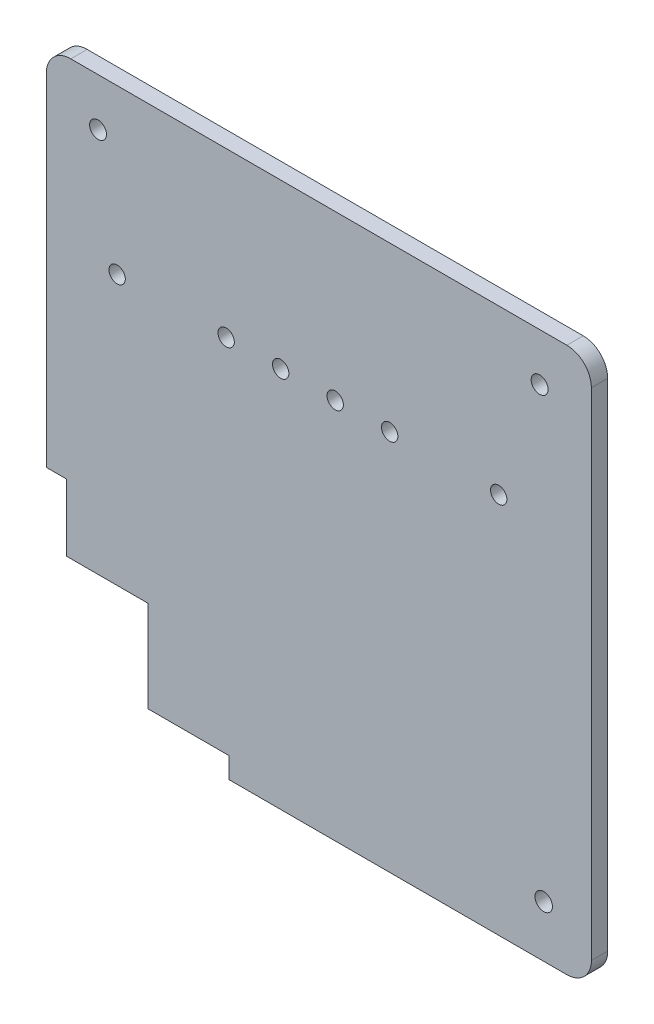
ISO-10303-21;
HEADER;
FILE_DESCRIPTION(('STEP AP214'),'2;1');
FILE_NAME('part.step','',(''),(''),'','','');
FILE_SCHEMA(('AUTOMOTIVE_DESIGN { 1 0 10303 214 1 1 1 1 }'));
ENDSEC;
DATA;
#1=APPLICATION_CONTEXT('core data for automotive mechanical design processes');
#2=APPLICATION_PROTOCOL_DEFINITION('international standard','automotive_design',2000,#1);
#3=PRODUCT_CONTEXT('',#1,'mechanical');
#4=PRODUCT('Part','Part','',(#3));
#5=PRODUCT_RELATED_PRODUCT_CATEGORY('part','',(#4));
#6=PRODUCT_DEFINITION_FORMATION('','',#4);
#7=PRODUCT_DEFINITION_CONTEXT('part definition',#1,'design');
#8=PRODUCT_DEFINITION('design','',#6,#7);
#9=PRODUCT_DEFINITION_SHAPE('','',#8);
#10=(LENGTH_UNIT() NAMED_UNIT(*) SI_UNIT(.MILLI.,.METRE.));
#11=(NAMED_UNIT(*) PLANE_ANGLE_UNIT() SI_UNIT($,.RADIAN.));
#12=(NAMED_UNIT(*) SI_UNIT($,.STERADIAN.) SOLID_ANGLE_UNIT());
#13=UNCERTAINTY_MEASURE_WITH_UNIT(LENGTH_MEASURE(1.E-05),#10,'distance_accuracy_value','');
#14=(GEOMETRIC_REPRESENTATION_CONTEXT(3) GLOBAL_UNCERTAINTY_ASSIGNED_CONTEXT((#13)) GLOBAL_UNIT_ASSIGNED_CONTEXT((#10,
#11,#12)) REPRESENTATION_CONTEXT('',''));
#15=CARTESIAN_POINT('',(0.,0.,0.));
#16=DIRECTION('',(0.,0.,1.));
#17=DIRECTION('',(1.,0.,0.));
#18=AXIS2_PLACEMENT_3D('',#15,#16,#17);
#19=CARTESIAN_POINT('',(0.,0.,0.));
#20=DIRECTION('',(0.,0.,-1.));
#21=DIRECTION('',(-1.,0.,0.));
#22=AXIS2_PLACEMENT_3D('',#19,#20,#21);
#23=PLANE('',#22);
#24=CARTESIAN_POINT('',(99.7846255346123,71.7613539983955,0.));
#25=DIRECTION('',(0.,0.,-1.));
#26=DIRECTION('',(-1.,0.,0.));
#27=AXIS2_PLACEMENT_3D('',#24,#25,#26);
#28=CIRCLE('',#27,1.50000000000001);
#29=CARTESIAN_POINT('',(98.2846255346123,71.7613539983955,0.));
#30=VERTEX_POINT('',#29);
#31=EDGE_CURVE('E320',#30,#30,#28,.T.);
#32=ORIENTED_EDGE('',*,*,#31,.F.);
#33=EDGE_LOOP('',(#32));
#34=FACE_BOUND('',#33,.T.);
#35=CARTESIAN_POINT('',(79.7846255346123,71.7613539983955,0.));
#36=DIRECTION('',(0.,0.,-1.));
#37=DIRECTION('',(-1.,0.,0.));
#38=AXIS2_PLACEMENT_3D('',#35,#36,#37);
#39=CIRCLE('',#38,1.5);
#40=CARTESIAN_POINT('',(78.2846255346123,71.7613539983955,0.));
#41=VERTEX_POINT('',#40);
#42=EDGE_CURVE('E324',#41,#41,#39,.T.);
#43=ORIENTED_EDGE('',*,*,#42,.F.);
#44=EDGE_LOOP('',(#43));
#45=FACE_BOUND('',#44,.T.);
#46=CARTESIAN_POINT('',(69.7846255346123,71.7613539983955,0.));
#47=DIRECTION('',(0.,0.,-1.));
#48=DIRECTION('',(-1.,0.,0.));
#49=AXIS2_PLACEMENT_3D('',#46,#47,#48);
#50=CIRCLE('',#49,1.5);
#51=CARTESIAN_POINT('',(68.2846255346123,71.7613539983955,0.));
#52=VERTEX_POINT('',#51);
#53=EDGE_CURVE('E328',#52,#52,#50,.T.);
#54=ORIENTED_EDGE('',*,*,#53,.F.);
#55=EDGE_LOOP('',(#54));
#56=FACE_BOUND('',#55,.T.);
#57=CARTESIAN_POINT('',(59.7846255346123,71.7613539983955,0.));
#58=DIRECTION('',(0.,0.,-1.));
#59=DIRECTION('',(-1.,0.,0.));
#60=AXIS2_PLACEMENT_3D('',#57,#58,#59);
#61=CIRCLE('',#60,1.5);
#62=CARTESIAN_POINT('',(58.2846255346123,71.7613539983955,0.));
#63=VERTEX_POINT('',#62);
#64=EDGE_CURVE('E332',#63,#63,#61,.T.);
#65=ORIENTED_EDGE('',*,*,#64,.F.);
#66=EDGE_LOOP('',(#65));
#67=FACE_BOUND('',#66,.T.);
#68=CARTESIAN_POINT('',(49.7846255346123,71.7613539983955,0.));
#69=DIRECTION('',(0.,0.,-1.));
#70=DIRECTION('',(-1.,0.,0.));
#71=AXIS2_PLACEMENT_3D('',#68,#69,#70);
#72=CIRCLE('',#71,1.5);
#73=CARTESIAN_POINT('',(48.2846255346123,71.7613539983955,0.));
#74=VERTEX_POINT('',#73);
#75=EDGE_CURVE('E336',#74,#74,#72,.T.);
#76=ORIENTED_EDGE('',*,*,#75,.F.);
#77=EDGE_LOOP('',(#76));
#78=FACE_BOUND('',#77,.T.);
#79=CARTESIAN_POINT('',(29.7846255346123,71.7613539983955,0.));
#80=DIRECTION('',(0.,0.,-1.));
#81=DIRECTION('',(-1.,0.,0.));
#82=AXIS2_PLACEMENT_3D('',#79,#80,#81);
#83=CIRCLE('',#82,1.5);
#84=CARTESIAN_POINT('',(28.2846255346123,71.7613539983955,0.));
#85=VERTEX_POINT('',#84);
#86=EDGE_CURVE('E340',#85,#85,#83,.T.);
#87=ORIENTED_EDGE('',*,*,#86,.F.);
#88=EDGE_LOOP('',(#87));
#89=FACE_BOUND('',#88,.T.);
#90=CARTESIAN_POINT('',(108.034625534612,11.2613539983955,0.));
#91=DIRECTION('',(0.,0.,-1.));
#92=DIRECTION('',(-1.,0.,0.));
#93=AXIS2_PLACEMENT_3D('',#90,#91,#92);
#94=CIRCLE('',#93,1.60000000000002);
#95=CARTESIAN_POINT('',(106.434625534612,11.2613539983955,0.));
#96=VERTEX_POINT('',#95);
#97=EDGE_CURVE('E344',#96,#96,#94,.T.);
#98=ORIENTED_EDGE('',*,*,#97,.F.);
#99=EDGE_LOOP('',(#98));
#100=FACE_BOUND('',#99,.T.);
#101=CARTESIAN_POINT('',(107.284625534612,93.0113539983955,0.));
#102=DIRECTION('',(0.,0.,-1.));
#103=DIRECTION('',(-1.,0.,0.));
#104=AXIS2_PLACEMENT_3D('',#101,#102,#103);
#105=CIRCLE('',#104,1.54999999999999);
#106=CARTESIAN_POINT('',(105.734625534612,93.0113539983955,0.));
#107=VERTEX_POINT('',#106);
#108=EDGE_CURVE('E348',#107,#107,#105,.T.);
#109=ORIENTED_EDGE('',*,*,#108,.F.);
#110=EDGE_LOOP('',(#109));
#111=FACE_BOUND('',#110,.T.);
#112=CARTESIAN_POINT('',(26.2846255346123,93.0113539983955,0.));
#113=DIRECTION('',(0.,0.,-1.));
#114=DIRECTION('',(-1.,0.,0.));
#115=AXIS2_PLACEMENT_3D('',#112,#113,#114);
#116=CIRCLE('',#115,1.54999999999999);
#117=CARTESIAN_POINT('',(24.7346255346123,93.0113539983955,0.));
#118=VERTEX_POINT('',#117);
#119=EDGE_CURVE('E268',#118,#118,#116,.T.);
#120=ORIENTED_EDGE('',*,*,#119,.F.);
#121=EDGE_LOOP('',(#120));
#122=FACE_BOUND('',#121,.T.);
#123=DIRECTION('',(0.,1.,0.));
#124=VECTOR('',#123,1.);
#125=CARTESIAN_POINT('',(20.4908440418059,0.,0.));
#126=LINE('',#125,#124);
#127=CARTESIAN_POINT('',(20.4908440418059,22.3527007298538,0.));
#128=VERTEX_POINT('',#127);
#129=CARTESIAN_POINT('',(20.4908440418059,34.6134342155972,0.));
#130=VERTEX_POINT('',#129);
#131=EDGE_CURVE('E195',#128,#130,#126,.T.);
#132=ORIENTED_EDGE('',*,*,#131,.T.);
#133=DIRECTION('',(-1.,0.,0.));
#134=VECTOR('',#133,1.);
#135=CARTESIAN_POINT('',(0.,34.6134342155972,0.));
#136=LINE('',#135,#134);
#137=CARTESIAN_POINT('',(16.7846255346119,34.6134342155972,0.));
#138=VERTEX_POINT('',#137);
#139=EDGE_CURVE('E11',#130,#138,#136,.T.);
#140=ORIENTED_EDGE('',*,*,#139,.T.);
#141=DIRECTION('',(0.,1.,0.));
#142=VECTOR('',#141,1.);
#143=CARTESIAN_POINT('',(16.7846255346117,-1.05037335566736E-13,0.));
#144=LINE('',#143,#142);
#145=CARTESIAN_POINT('',(16.7846255346123,97.2613539983955,0.));
#146=VERTEX_POINT('',#145);
#147=EDGE_CURVE('E39',#138,#146,#144,.T.);
#148=ORIENTED_EDGE('',*,*,#147,.T.);
#149=CARTESIAN_POINT('',(21.2846255346123,101.761353998396,0.));
#150=CARTESIAN_POINT('',(18.79523963462,101.818752836915,0.));
#151=CARTESIAN_POINT('',(16.8145351645291,99.6683323546178,0.));
#152=CARTESIAN_POINT('',(16.7846255346123,97.2613539983955,0.));
#153=B_SPLINE_CURVE_WITH_KNOTS('',3,(#149,#150,#151,#152),.UNSPECIFIED.,.F.,.F.,(4,4),(0.,1.),.UNSPECIFIED.);
#154=CARTESIAN_POINT('',(21.2846255346123,101.761353998396,0.));
#155=VERTEX_POINT('',#154);
#156=EDGE_CURVE('E251',#146,#155,#153,.F.);
#157=ORIENTED_EDGE('',*,*,#156,.T.);
#158=DIRECTION('',(1.,0.,0.));
#159=VECTOR('',#158,1.);
#160=CARTESIAN_POINT('',(0.,101.761353998396,0.));
#161=LINE('',#160,#159);
#162=CARTESIAN_POINT('',(112.284625534612,101.761353998396,0.));
#163=VERTEX_POINT('',#162);
#164=EDGE_CURVE('E245',#155,#163,#161,.T.);
#165=ORIENTED_EDGE('',*,*,#164,.T.);
#166=CARTESIAN_POINT('',(116.784625534612,97.2613539983955,0.));
#167=CARTESIAN_POINT('',(116.737279379155,99.8430426283221,0.));
#168=CARTESIAN_POINT('',(114.750732895399,101.731954246416,0.));
#169=CARTESIAN_POINT('',(112.284625534612,101.761353998396,0.));
#170=B_SPLINE_CURVE_WITH_KNOTS('',3,(#166,#167,#168,#169),.UNSPECIFIED.,.F.,.F.,(4,4),(0.,1.),.UNSPECIFIED.);
#171=CARTESIAN_POINT('',(116.784625534612,97.2613539983955,0.));
#172=VERTEX_POINT('',#171);
#173=EDGE_CURVE('E240',#163,#172,#170,.F.);
#174=ORIENTED_EDGE('',*,*,#173,.T.);
#175=DIRECTION('',(0.,-1.,0.));
#176=VECTOR('',#175,1.);
#177=CARTESIAN_POINT('',(116.784625534612,0.,0.));
#178=LINE('',#177,#176);
#179=CARTESIAN_POINT('',(116.784625534612,6.26135399839553,0.));
#180=VERTEX_POINT('',#179);
#181=EDGE_CURVE('E234',#172,#180,#178,.T.);
#182=ORIENTED_EDGE('',*,*,#181,.T.);
#183=CARTESIAN_POINT('',(112.284625534612,1.76135399839554,0.));
#184=CARTESIAN_POINT('',(114.734063302565,1.7748496881843,0.));
#185=CARTESIAN_POINT('',(116.776314504094,3.74614166838155,0.));
#186=CARTESIAN_POINT('',(116.784625534612,6.26135399839554,0.));
#187=B_SPLINE_CURVE_WITH_KNOTS('',3,(#183,#184,#185,#186),.UNSPECIFIED.,.F.,.F.,(4,4),(0.,1.),.UNSPECIFIED.);
#188=CARTESIAN_POINT('',(112.284625534612,1.76135399839554,0.));
#189=VERTEX_POINT('',#188);
#190=EDGE_CURVE('E229',#180,#189,#187,.F.);
#191=ORIENTED_EDGE('',*,*,#190,.T.);
#192=DIRECTION('',(-1.,0.,0.));
#193=VECTOR('',#192,1.);
#194=CARTESIAN_POINT('',(0.,1.76135399839553,0.));
#195=LINE('',#194,#193);
#196=CARTESIAN_POINT('',(50.3045910073756,1.76135399839553,0.));
#197=VERTEX_POINT('',#196);
#198=EDGE_CURVE('E226',#189,#197,#195,.T.);
#199=ORIENTED_EDGE('',*,*,#198,.T.);
#200=DIRECTION('',(0.,1.,0.));
#201=VECTOR('',#200,1.);
#202=CARTESIAN_POINT('',(50.3045910073756,0.,0.));
#203=LINE('',#202,#201);
#204=CARTESIAN_POINT('',(50.3045910073756,5.58312747882928,0.));
#205=VERTEX_POINT('',#204);
#206=EDGE_CURVE('E223',#197,#205,#203,.T.);
#207=ORIENTED_EDGE('',*,*,#206,.T.);
#208=DIRECTION('',(-1.,0.,0.));
#209=VECTOR('',#208,1.);
#210=CARTESIAN_POINT('',(0.,5.58312747882928,0.));
#211=LINE('',#210,#209);
#212=CARTESIAN_POINT('',(35.4429490806915,5.58312747882928,0.));
#213=VERTEX_POINT('',#212);
#214=EDGE_CURVE('E220',#205,#213,#211,.T.);
#215=ORIENTED_EDGE('',*,*,#214,.T.);
#216=DIRECTION('',(0.,1.,0.));
#217=VECTOR('',#216,1.);
#218=CARTESIAN_POINT('',(35.4429490806915,0.,0.));
#219=LINE('',#218,#217);
#220=CARTESIAN_POINT('',(35.4429490806914,22.3527007298538,0.));
#221=VERTEX_POINT('',#220);
#222=EDGE_CURVE('E218',#213,#221,#219,.T.);
#223=ORIENTED_EDGE('',*,*,#222,.T.);
#224=DIRECTION('',(-1.,0.,0.));
#225=VECTOR('',#224,1.);
#226=CARTESIAN_POINT('',(0.,22.3527007298538,0.));
#227=LINE('',#226,#225);
#228=EDGE_CURVE('E129',#221,#128,#227,.T.);
#229=ORIENTED_EDGE('',*,*,#228,.T.);
#230=EDGE_LOOP('',(#132,#140,#148,#157,#165,#174,#182,#191,#199,#207,#215,#223,#229));
#231=FACE_BOUND('',#230,.T.);
#232=ADVANCED_FACE('F32',(#34,#45,#56,#67,#78,#89,#100,#111,#122,#231),#23,.T.);
#233=CARTESIAN_POINT('',(16.7846255346119,34.6134342155972,-7.));
#234=DIRECTION('',(0.,-1.,0.));
#235=DIRECTION('',(0.,0.,-1.));
#236=AXIS2_PLACEMENT_3D('',#233,#234,#235);
#237=PLANE('',#236);
#238=DIRECTION('',(0.,0.,1.));
#239=VECTOR('',#238,1.);
#240=CARTESIAN_POINT('',(20.4908440418059,34.6134342155972,-7.));
#241=LINE('',#240,#239);
#242=CARTESIAN_POINT('',(20.4908440418059,34.6134342155972,3.));
#243=VERTEX_POINT('',#242);
#244=EDGE_CURVE('E54',#130,#243,#241,.T.);
#245=ORIENTED_EDGE('',*,*,#244,.T.);
#246=DIRECTION('',(1.,0.,0.));
#247=VECTOR('',#246,1.);
#248=CARTESIAN_POINT('',(16.7846255346119,34.6134342155972,3.));
#249=LINE('',#248,#247);
#250=CARTESIAN_POINT('',(16.7846255346119,34.6134342155972,3.));
#251=VERTEX_POINT('',#250);
#252=EDGE_CURVE('E149',#251,#243,#249,.T.);
#253=ORIENTED_EDGE('',*,*,#252,.F.);
#254=DIRECTION('',(0.,0.,1.));
#255=VECTOR('',#254,1.);
#256=CARTESIAN_POINT('',(16.7846255346119,34.6134342155972,-7.));
#257=LINE('',#256,#255);
#258=EDGE_CURVE('E193',#138,#251,#257,.T.);
#259=ORIENTED_EDGE('',*,*,#258,.F.);
#260=ORIENTED_EDGE('',*,*,#139,.F.);
#261=EDGE_LOOP('',(#245,#253,#259,#260));
#262=FACE_BOUND('',#261,.T.);
#263=ADVANCED_FACE('F267',(#262),#237,.T.);
#264=CARTESIAN_POINT('',(16.7846255346119,34.6134342155972,-7.));
#265=DIRECTION('',(-1.,0.,0.));
#266=DIRECTION('',(0.,-1.,0.));
#267=AXIS2_PLACEMENT_3D('',#264,#265,#266);
#268=PLANE('',#267);
#269=ORIENTED_EDGE('',*,*,#258,.T.);
#270=DIRECTION('',(0.,-1.,0.));
#271=VECTOR('',#270,1.);
#272=CARTESIAN_POINT('',(16.7846255346119,34.6134342155972,3.));
#273=LINE('',#272,#271);
#274=CARTESIAN_POINT('',(16.7846255346123,97.2613539983955,3.));
#275=VERTEX_POINT('',#274);
#276=EDGE_CURVE('E187',#275,#251,#273,.T.);
#277=ORIENTED_EDGE('',*,*,#276,.F.);
#278=DIRECTION('',(0.,0.,1.));
#279=VECTOR('',#278,1.);
#280=CARTESIAN_POINT('',(16.7846255346123,97.2613539983955,-7.));
#281=LINE('',#280,#279);
#282=EDGE_CURVE('E196',#146,#275,#281,.T.);
#283=ORIENTED_EDGE('',*,*,#282,.F.);
#284=ORIENTED_EDGE('',*,*,#147,.F.);
#285=EDGE_LOOP('',(#269,#277,#283,#284));
#286=FACE_BOUND('',#285,.T.);
#287=ADVANCED_FACE('F263',(#286),#268,.T.);
#288=CARTESIAN_POINT('',(21.2846255346123,101.761353998396,-7.));
#289=CARTESIAN_POINT('',(18.79523963462,101.818752836915,-7.));
#290=CARTESIAN_POINT('',(16.8145351645291,99.6683323546178,-7.));
#291=CARTESIAN_POINT('',(16.7846255346123,97.2613539983955,-7.));
#292=B_SPLINE_CURVE_WITH_KNOTS('',3,(#288,#289,#290,#291),.UNSPECIFIED.,.F.,.F.,(4,4),(0.,1.),.UNSPECIFIED.);
#293=DIRECTION('',(0.,0.,1.));
#294=VECTOR('',#293,1.);
#295=SURFACE_OF_LINEAR_EXTRUSION('',#292,#294);
#296=ORIENTED_EDGE('',*,*,#282,.T.);
#297=CARTESIAN_POINT('',(21.2846255346123,101.761353998396,3.));
#298=CARTESIAN_POINT('',(18.79523963462,101.818752836915,3.));
#299=CARTESIAN_POINT('',(16.8145351645291,99.6683323546178,3.));
#300=CARTESIAN_POINT('',(16.7846255346123,97.2613539983955,3.));
#301=B_SPLINE_CURVE_WITH_KNOTS('',3,(#297,#298,#299,#300),.UNSPECIFIED.,.F.,.F.,(4,4),(0.,1.),.UNSPECIFIED.);
#302=CARTESIAN_POINT('',(21.2846255346123,101.761353998396,3.));
#303=VERTEX_POINT('',#302);
#304=EDGE_CURVE('E182',#303,#275,#301,.T.);
#305=ORIENTED_EDGE('',*,*,#304,.F.);
#306=DIRECTION('',(0.,0.,1.));
#307=VECTOR('',#306,1.);
#308=CARTESIAN_POINT('',(21.2846255346123,101.761353998396,-7.));
#309=LINE('',#308,#307);
#310=EDGE_CURVE('E198',#155,#303,#309,.T.);
#311=ORIENTED_EDGE('',*,*,#310,.F.);
#312=ORIENTED_EDGE('',*,*,#156,.F.);
#313=EDGE_LOOP('',(#296,#305,#311,#312));
#314=FACE_BOUND('',#313,.T.);
#315=ADVANCED_FACE('F273',(#314),#295,.T.);
#316=CARTESIAN_POINT('',(112.284625534612,101.761353998396,-7.));
#317=DIRECTION('',(0.,1.,0.));
#318=DIRECTION('',(0.,0.,1.));
#319=AXIS2_PLACEMENT_3D('',#316,#317,#318);
#320=PLANE('',#319);
#321=ORIENTED_EDGE('',*,*,#310,.T.);
#322=DIRECTION('',(-1.,0.,0.));
#323=VECTOR('',#322,1.);
#324=CARTESIAN_POINT('',(112.284625534612,101.761353998396,3.));
#325=LINE('',#324,#323);
#326=CARTESIAN_POINT('',(112.284625534612,101.761353998396,3.));
#327=VERTEX_POINT('',#326);
#328=EDGE_CURVE('E176',#327,#303,#325,.T.);
#329=ORIENTED_EDGE('',*,*,#328,.F.);
#330=DIRECTION('',(0.,0.,1.));
#331=VECTOR('',#330,1.);
#332=CARTESIAN_POINT('',(112.284625534612,101.761353998396,-7.));
#333=LINE('',#332,#331);
#334=EDGE_CURVE('E200',#163,#327,#333,.T.);
#335=ORIENTED_EDGE('',*,*,#334,.F.);
#336=ORIENTED_EDGE('',*,*,#164,.F.);
#337=EDGE_LOOP('',(#321,#329,#335,#336));
#338=FACE_BOUND('',#337,.T.);
#339=ADVANCED_FACE('F275',(#338),#320,.T.);
#340=CARTESIAN_POINT('',(116.784625534612,97.2613539983955,-7.));
#341=CARTESIAN_POINT('',(116.737279379155,99.8430426283221,-7.));
#342=CARTESIAN_POINT('',(114.750732895399,101.731954246416,-7.));
#343=CARTESIAN_POINT('',(112.284625534612,101.761353998396,-7.));
#344=B_SPLINE_CURVE_WITH_KNOTS('',3,(#340,#341,#342,#343),.UNSPECIFIED.,.F.,.F.,(4,4),(0.,1.),.UNSPECIFIED.);
#345=DIRECTION('',(0.,0.,1.));
#346=VECTOR('',#345,1.);
#347=SURFACE_OF_LINEAR_EXTRUSION('',#344,#346);
#348=ORIENTED_EDGE('',*,*,#334,.T.);
#349=CARTESIAN_POINT('',(116.784625534612,97.2613539983955,3.));
#350=CARTESIAN_POINT('',(116.737279379155,99.8430426283221,3.));
#351=CARTESIAN_POINT('',(114.750732895399,101.731954246416,3.));
#352=CARTESIAN_POINT('',(112.284625534612,101.761353998396,3.));
#353=B_SPLINE_CURVE_WITH_KNOTS('',3,(#349,#350,#351,#352),.UNSPECIFIED.,.F.,.F.,(4,4),(0.,1.),.UNSPECIFIED.);
#354=CARTESIAN_POINT('',(116.784625534612,97.2613539983955,3.));
#355=VERTEX_POINT('',#354);
#356=EDGE_CURVE('E171',#355,#327,#353,.T.);
#357=ORIENTED_EDGE('',*,*,#356,.F.);
#358=DIRECTION('',(0.,0.,1.));
#359=VECTOR('',#358,1.);
#360=CARTESIAN_POINT('',(116.784625534612,97.2613539983955,-7.));
#361=LINE('',#360,#359);
#362=EDGE_CURVE('E202',#172,#355,#361,.T.);
#363=ORIENTED_EDGE('',*,*,#362,.F.);
#364=ORIENTED_EDGE('',*,*,#173,.F.);
#365=EDGE_LOOP('',(#348,#357,#363,#364));
#366=FACE_BOUND('',#365,.T.);
#367=ADVANCED_FACE('F279',(#366),#347,.T.);
#368=CARTESIAN_POINT('',(116.784625534612,6.26135399839553,-7.));
#369=DIRECTION('',(1.,0.,0.));
#370=DIRECTION('',(0.,0.,-1.));
#371=AXIS2_PLACEMENT_3D('',#368,#369,#370);
#372=PLANE('',#371);
#373=ORIENTED_EDGE('',*,*,#362,.T.);
#374=DIRECTION('',(0.,1.,0.));
#375=VECTOR('',#374,1.);
#376=CARTESIAN_POINT('',(116.784625534612,6.26135399839553,3.));
#377=LINE('',#376,#375);
#378=CARTESIAN_POINT('',(116.784625534612,6.26135399839553,3.));
#379=VERTEX_POINT('',#378);
#380=EDGE_CURVE('E165',#379,#355,#377,.T.);
#381=ORIENTED_EDGE('',*,*,#380,.F.);
#382=DIRECTION('',(0.,0.,1.));
#383=VECTOR('',#382,1.);
#384=CARTESIAN_POINT('',(116.784625534612,6.26135399839553,-7.));
#385=LINE('',#384,#383);
#386=EDGE_CURVE('E204',#180,#379,#385,.T.);
#387=ORIENTED_EDGE('',*,*,#386,.F.);
#388=ORIENTED_EDGE('',*,*,#181,.F.);
#389=EDGE_LOOP('',(#373,#381,#387,#388));
#390=FACE_BOUND('',#389,.T.);
#391=ADVANCED_FACE('F283',(#390),#372,.T.);
#392=CARTESIAN_POINT('',(112.284625534612,1.76135399839554,-7.));
#393=CARTESIAN_POINT('',(114.734063302565,1.7748496881843,-7.));
#394=CARTESIAN_POINT('',(116.776314504094,3.74614166838155,-7.));
#395=CARTESIAN_POINT('',(116.784625534612,6.26135399839554,-7.));
#396=B_SPLINE_CURVE_WITH_KNOTS('',3,(#392,#393,#394,#395),.UNSPECIFIED.,.F.,.F.,(4,4),(0.,1.),.UNSPECIFIED.);
#397=DIRECTION('',(0.,0.,1.));
#398=VECTOR('',#397,1.);
#399=SURFACE_OF_LINEAR_EXTRUSION('',#396,#398);
#400=ORIENTED_EDGE('',*,*,#386,.T.);
#401=CARTESIAN_POINT('',(112.284625534612,1.76135399839554,3.));
#402=CARTESIAN_POINT('',(114.734063302565,1.7748496881843,3.));
#403=CARTESIAN_POINT('',(116.776314504094,3.74614166838155,3.));
#404=CARTESIAN_POINT('',(116.784625534612,6.26135399839554,3.));
#405=B_SPLINE_CURVE_WITH_KNOTS('',3,(#401,#402,#403,#404),.UNSPECIFIED.,.F.,.F.,(4,4),(0.,1.),.UNSPECIFIED.);
#406=CARTESIAN_POINT('',(112.284625534612,1.76135399839554,3.));
#407=VERTEX_POINT('',#406);
#408=EDGE_CURVE('E160',#407,#379,#405,.T.);
#409=ORIENTED_EDGE('',*,*,#408,.F.);
#410=DIRECTION('',(0.,0.,1.));
#411=VECTOR('',#410,1.);
#412=CARTESIAN_POINT('',(112.284625534612,1.76135399839554,-7.));
#413=LINE('',#412,#411);
#414=EDGE_CURVE('E206',#189,#407,#413,.T.);
#415=ORIENTED_EDGE('',*,*,#414,.F.);
#416=ORIENTED_EDGE('',*,*,#190,.F.);
#417=EDGE_LOOP('',(#400,#409,#415,#416));
#418=FACE_BOUND('',#417,.T.);
#419=ADVANCED_FACE('F287',(#418),#399,.T.);
#420=CARTESIAN_POINT('',(50.3045910073756,1.76135399839553,-7.));
#421=DIRECTION('',(0.,-1.,0.));
#422=DIRECTION('',(0.,0.,-1.));
#423=AXIS2_PLACEMENT_3D('',#420,#421,#422);
#424=PLANE('',#423);
#425=ORIENTED_EDGE('',*,*,#414,.T.);
#426=DIRECTION('',(1.,0.,0.));
#427=VECTOR('',#426,1.);
#428=CARTESIAN_POINT('',(50.3045910073756,1.76135399839553,3.));
#429=LINE('',#428,#427);
#430=CARTESIAN_POINT('',(50.3045910073756,1.76135399839553,3.));
#431=VERTEX_POINT('',#430);
#432=EDGE_CURVE('E157',#431,#407,#429,.T.);
#433=ORIENTED_EDGE('',*,*,#432,.F.);
#434=DIRECTION('',(0.,0.,1.));
#435=VECTOR('',#434,1.);
#436=CARTESIAN_POINT('',(50.3045910073756,1.76135399839553,-7.));
#437=LINE('',#436,#435);
#438=EDGE_CURVE('E208',#197,#431,#437,.T.);
#439=ORIENTED_EDGE('',*,*,#438,.F.);
#440=ORIENTED_EDGE('',*,*,#198,.F.);
#441=EDGE_LOOP('',(#425,#433,#439,#440));
#442=FACE_BOUND('',#441,.T.);
#443=ADVANCED_FACE('F291',(#442),#424,.T.);
#444=CARTESIAN_POINT('',(50.3045910073756,5.58312747882928,-7.));
#445=DIRECTION('',(-1.,0.,0.));
#446=DIRECTION('',(0.,0.,1.));
#447=AXIS2_PLACEMENT_3D('',#444,#445,#446);
#448=PLANE('',#447);
#449=ORIENTED_EDGE('',*,*,#438,.T.);
#450=DIRECTION('',(0.,-1.,0.));
#451=VECTOR('',#450,1.);
#452=CARTESIAN_POINT('',(50.3045910073756,5.58312747882928,3.));
#453=LINE('',#452,#451);
#454=CARTESIAN_POINT('',(50.3045910073756,5.58312747882928,3.));
#455=VERTEX_POINT('',#454);
#456=EDGE_CURVE('E154',#455,#431,#453,.T.);
#457=ORIENTED_EDGE('',*,*,#456,.F.);
#458=DIRECTION('',(0.,0.,1.));
#459=VECTOR('',#458,1.);
#460=CARTESIAN_POINT('',(50.3045910073756,5.58312747882928,-7.));
#461=LINE('',#460,#459);
#462=EDGE_CURVE('E210',#205,#455,#461,.T.);
#463=ORIENTED_EDGE('',*,*,#462,.F.);
#464=ORIENTED_EDGE('',*,*,#206,.F.);
#465=EDGE_LOOP('',(#449,#457,#463,#464));
#466=FACE_BOUND('',#465,.T.);
#467=ADVANCED_FACE('F295',(#466),#448,.T.);
#468=CARTESIAN_POINT('',(35.4429490806915,5.58312747882928,-7.));
#469=DIRECTION('',(0.,-1.,0.));
#470=DIRECTION('',(0.,0.,-1.));
#471=AXIS2_PLACEMENT_3D('',#468,#469,#470);
#472=PLANE('',#471);
#473=ORIENTED_EDGE('',*,*,#462,.T.);
#474=DIRECTION('',(1.,0.,0.));
#475=VECTOR('',#474,1.);
#476=CARTESIAN_POINT('',(35.4429490806915,5.58312747882928,3.));
#477=LINE('',#476,#475);
#478=CARTESIAN_POINT('',(35.4429490806915,5.58312747882928,3.));
#479=VERTEX_POINT('',#478);
#480=EDGE_CURVE('E142',#479,#455,#477,.T.);
#481=ORIENTED_EDGE('',*,*,#480,.F.);
#482=DIRECTION('',(0.,0.,1.));
#483=VECTOR('',#482,1.);
#484=CARTESIAN_POINT('',(35.4429490806915,5.58312747882928,-7.));
#485=LINE('',#484,#483);
#486=EDGE_CURVE('E132',#213,#479,#485,.T.);
#487=ORIENTED_EDGE('',*,*,#486,.F.);
#488=ORIENTED_EDGE('',*,*,#214,.F.);
#489=EDGE_LOOP('',(#473,#481,#487,#488));
#490=FACE_BOUND('',#489,.T.);
#491=ADVANCED_FACE('F298',(#490),#472,.T.);
#492=CARTESIAN_POINT('',(35.4429490806914,22.3527007298538,-7.));
#493=DIRECTION('',(-1.,0.,0.));
#494=DIRECTION('',(0.,-1.,0.));
#495=AXIS2_PLACEMENT_3D('',#492,#493,#494);
#496=PLANE('',#495);
#497=ORIENTED_EDGE('',*,*,#486,.T.);
#498=DIRECTION('',(0.,-1.,0.));
#499=VECTOR('',#498,1.);
#500=CARTESIAN_POINT('',(35.4429490806914,22.3527007298538,3.));
#501=LINE('',#500,#499);
#502=CARTESIAN_POINT('',(35.4429490806914,22.3527007298538,3.));
#503=VERTEX_POINT('',#502);
#504=EDGE_CURVE('E136',#503,#479,#501,.T.);
#505=ORIENTED_EDGE('',*,*,#504,.F.);
#506=DIRECTION('',(0.,0.,1.));
#507=VECTOR('',#506,1.);
#508=CARTESIAN_POINT('',(35.4429490806914,22.3527007298538,-7.));
#509=LINE('',#508,#507);
#510=EDGE_CURVE('E125',#221,#503,#509,.T.);
#511=ORIENTED_EDGE('',*,*,#510,.F.);
#512=ORIENTED_EDGE('',*,*,#222,.F.);
#513=EDGE_LOOP('',(#497,#505,#511,#512));
#514=FACE_BOUND('',#513,.T.);
#515=ADVANCED_FACE('F137',(#514),#496,.T.);
#516=CARTESIAN_POINT('',(20.4908440418059,22.3527007298538,-7.));
#517=DIRECTION('',(0.,-1.,0.));
#518=DIRECTION('',(0.,0.,-1.));
#519=AXIS2_PLACEMENT_3D('',#516,#517,#518);
#520=PLANE('',#519);
#521=ORIENTED_EDGE('',*,*,#510,.T.);
#522=DIRECTION('',(1.,0.,0.));
#523=VECTOR('',#522,1.);
#524=CARTESIAN_POINT('',(20.4908440418059,22.3527007298538,3.));
#525=LINE('',#524,#523);
#526=CARTESIAN_POINT('',(20.4908440418059,22.3527007298538,3.));
#527=VERTEX_POINT('',#526);
#528=EDGE_CURVE('E46',#527,#503,#525,.T.);
#529=ORIENTED_EDGE('',*,*,#528,.F.);
#530=DIRECTION('',(0.,0.,1.));
#531=VECTOR('',#530,1.);
#532=CARTESIAN_POINT('',(20.4908440418059,22.3527007298538,-7.));
#533=LINE('',#532,#531);
#534=EDGE_CURVE('E133',#128,#527,#533,.T.);
#535=ORIENTED_EDGE('',*,*,#534,.F.);
#536=ORIENTED_EDGE('',*,*,#228,.F.);
#537=EDGE_LOOP('',(#521,#529,#535,#536));
#538=FACE_BOUND('',#537,.T.);
#539=ADVANCED_FACE('F127',(#538),#520,.T.);
#540=CARTESIAN_POINT('',(20.4908440418059,34.6134342155972,-7.));
#541=DIRECTION('',(-1.,0.,0.));
#542=DIRECTION('',(0.,0.,1.));
#543=AXIS2_PLACEMENT_3D('',#540,#541,#542);
#544=PLANE('',#543);
#545=ORIENTED_EDGE('',*,*,#534,.T.);
#546=DIRECTION('',(0.,-1.,0.));
#547=VECTOR('',#546,1.);
#548=CARTESIAN_POINT('',(20.4908440418059,34.6134342155972,3.));
#549=LINE('',#548,#547);
#550=EDGE_CURVE('E147',#243,#527,#549,.T.);
#551=ORIENTED_EDGE('',*,*,#550,.F.);
#552=ORIENTED_EDGE('',*,*,#244,.F.);
#553=ORIENTED_EDGE('',*,*,#131,.F.);
#554=EDGE_LOOP('',(#545,#551,#552,#553));
#555=FACE_BOUND('',#554,.T.);
#556=ADVANCED_FACE('F299',(#555),#544,.T.);
#557=CARTESIAN_POINT('',(0.,0.,3.));
#558=DIRECTION('',(0.,0.,-1.));
#559=DIRECTION('',(-1.,0.,0.));
#560=AXIS2_PLACEMENT_3D('',#557,#558,#559);
#561=PLANE('',#560);
#562=CARTESIAN_POINT('',(99.7846255346123,71.7613539983955,3.));
#563=DIRECTION('',(0.,0.,1.));
#564=DIRECTION('',(1.,0.,0.));
#565=AXIS2_PLACEMENT_3D('',#562,#563,#564);
#566=CIRCLE('',#565,1.50000000000001);
#567=CARTESIAN_POINT('',(101.284625534612,71.7613539983955,3.));
#568=VERTEX_POINT('',#567);
#569=EDGE_CURVE('E570',#568,#568,#566,.T.);
#570=ORIENTED_EDGE('',*,*,#569,.F.);
#571=EDGE_LOOP('',(#570));
#572=FACE_BOUND('',#571,.T.);
#573=CARTESIAN_POINT('',(79.7846255346123,71.7613539983955,3.));
#574=DIRECTION('',(0.,0.,1.));
#575=DIRECTION('',(1.,0.,0.));
#576=AXIS2_PLACEMENT_3D('',#573,#574,#575);
#577=CIRCLE('',#576,1.5);
#578=CARTESIAN_POINT('',(81.2846255346123,71.7613539983955,3.));
#579=VERTEX_POINT('',#578);
#580=EDGE_CURVE('E572',#579,#579,#577,.T.);
#581=ORIENTED_EDGE('',*,*,#580,.F.);
#582=EDGE_LOOP('',(#581));
#583=FACE_BOUND('',#582,.T.);
#584=CARTESIAN_POINT('',(69.7846255346123,71.7613539983955,3.));
#585=DIRECTION('',(0.,0.,1.));
#586=DIRECTION('',(1.,0.,0.));
#587=AXIS2_PLACEMENT_3D('',#584,#585,#586);
#588=CIRCLE('',#587,1.5);
#589=CARTESIAN_POINT('',(71.2846255346123,71.7613539983955,3.));
#590=VERTEX_POINT('',#589);
#591=EDGE_CURVE('E578',#590,#590,#588,.T.);
#592=ORIENTED_EDGE('',*,*,#591,.F.);
#593=EDGE_LOOP('',(#592));
#594=FACE_BOUND('',#593,.T.);
#595=CARTESIAN_POINT('',(59.7846255346123,71.7613539983955,3.));
#596=DIRECTION('',(0.,0.,1.));
#597=DIRECTION('',(1.,0.,0.));
#598=AXIS2_PLACEMENT_3D('',#595,#596,#597);
#599=CIRCLE('',#598,1.5);
#600=CARTESIAN_POINT('',(61.2846255346123,71.7613539983955,3.));
#601=VERTEX_POINT('',#600);
#602=EDGE_CURVE('E582',#601,#601,#599,.T.);
#603=ORIENTED_EDGE('',*,*,#602,.F.);
#604=EDGE_LOOP('',(#603));
#605=FACE_BOUND('',#604,.T.);
#606=CARTESIAN_POINT('',(49.7846255346123,71.7613539983955,3.));
#607=DIRECTION('',(0.,0.,1.));
#608=DIRECTION('',(1.,0.,0.));
#609=AXIS2_PLACEMENT_3D('',#606,#607,#608);
#610=CIRCLE('',#609,1.5);
#611=CARTESIAN_POINT('',(51.2846255346123,71.7613539983955,3.));
#612=VERTEX_POINT('',#611);
#613=EDGE_CURVE('E586',#612,#612,#610,.T.);
#614=ORIENTED_EDGE('',*,*,#613,.F.);
#615=EDGE_LOOP('',(#614));
#616=FACE_BOUND('',#615,.T.);
#617=CARTESIAN_POINT('',(29.7846255346123,71.7613539983955,3.));
#618=DIRECTION('',(0.,0.,1.));
#619=DIRECTION('',(1.,0.,0.));
#620=AXIS2_PLACEMENT_3D('',#617,#618,#619);
#621=CIRCLE('',#620,1.5);
#622=CARTESIAN_POINT('',(31.2846255346123,71.7613539983955,3.));
#623=VERTEX_POINT('',#622);
#624=EDGE_CURVE('E590',#623,#623,#621,.T.);
#625=ORIENTED_EDGE('',*,*,#624,.F.);
#626=EDGE_LOOP('',(#625));
#627=FACE_BOUND('',#626,.T.);
#628=CARTESIAN_POINT('',(108.034625534612,11.2613539983955,3.));
#629=DIRECTION('',(0.,0.,1.));
#630=DIRECTION('',(1.,0.,0.));
#631=AXIS2_PLACEMENT_3D('',#628,#629,#630);
#632=CIRCLE('',#631,1.60000000000002);
#633=CARTESIAN_POINT('',(109.634625534612,11.2613539983955,3.));
#634=VERTEX_POINT('',#633);
#635=EDGE_CURVE('E594',#634,#634,#632,.T.);
#636=ORIENTED_EDGE('',*,*,#635,.F.);
#637=EDGE_LOOP('',(#636));
#638=FACE_BOUND('',#637,.T.);
#639=CARTESIAN_POINT('',(107.284625534612,93.0113539983955,3.));
#640=DIRECTION('',(0.,0.,1.));
#641=DIRECTION('',(1.,0.,0.));
#642=AXIS2_PLACEMENT_3D('',#639,#640,#641);
#643=CIRCLE('',#642,1.54999999999999);
#644=CARTESIAN_POINT('',(108.834625534612,93.0113539983955,3.));
#645=VERTEX_POINT('',#644);
#646=EDGE_CURVE('E598',#645,#645,#643,.T.);
#647=ORIENTED_EDGE('',*,*,#646,.F.);
#648=EDGE_LOOP('',(#647));
#649=FACE_BOUND('',#648,.T.);
#650=CARTESIAN_POINT('',(26.2846255346123,93.0113539983955,3.));
#651=DIRECTION('',(0.,0.,1.));
#652=DIRECTION('',(1.,0.,0.));
#653=AXIS2_PLACEMENT_3D('',#650,#651,#652);
#654=CIRCLE('',#653,1.54999999999999);
#655=CARTESIAN_POINT('',(27.8346255346123,93.0113539983955,3.));
#656=VERTEX_POINT('',#655);
#657=EDGE_CURVE('E352',#656,#656,#654,.T.);
#658=ORIENTED_EDGE('',*,*,#657,.F.);
#659=EDGE_LOOP('',(#658));
#660=FACE_BOUND('',#659,.T.);
#661=ORIENTED_EDGE('',*,*,#252,.T.);
#662=ORIENTED_EDGE('',*,*,#550,.T.);
#663=ORIENTED_EDGE('',*,*,#528,.T.);
#664=ORIENTED_EDGE('',*,*,#504,.T.);
#665=ORIENTED_EDGE('',*,*,#480,.T.);
#666=ORIENTED_EDGE('',*,*,#456,.T.);
#667=ORIENTED_EDGE('',*,*,#432,.T.);
#668=ORIENTED_EDGE('',*,*,#408,.T.);
#669=ORIENTED_EDGE('',*,*,#380,.T.);
#670=ORIENTED_EDGE('',*,*,#356,.T.);
#671=ORIENTED_EDGE('',*,*,#328,.T.);
#672=ORIENTED_EDGE('',*,*,#304,.T.);
#673=ORIENTED_EDGE('',*,*,#276,.T.);
#674=EDGE_LOOP('',(#661,#662,#663,#664,#665,#666,#667,#668,#669,#670,#671,#672,#673));
#675=FACE_BOUND('',#674,.T.);
#676=ADVANCED_FACE('F146',(#572,#583,#594,#605,#616,#627,#638,#649,#660,#675),#561,.F.);
#677=CARTESIAN_POINT('',(26.2846255346123,93.0113539983955,-7.));
#678=DIRECTION('',(0.,0.,1.));
#679=DIRECTION('',(1.,0.,0.));
#680=AXIS2_PLACEMENT_3D('',#677,#678,#679);
#681=CYLINDRICAL_SURFACE('',#680,1.54999999999999);
#682=ORIENTED_EDGE('',*,*,#119,.T.);
#683=EDGE_LOOP('',(#682));
#684=FACE_BOUND('',#683,.T.);
#685=ORIENTED_EDGE('',*,*,#657,.T.);
#686=EDGE_LOOP('',(#685));
#687=FACE_BOUND('',#686,.T.);
#688=ADVANCED_FACE('F307',(#684,#687),#681,.F.);
#689=CARTESIAN_POINT('',(107.284625534612,93.0113539983955,-7.));
#690=DIRECTION('',(0.,0.,1.));
#691=DIRECTION('',(1.,0.,0.));
#692=AXIS2_PLACEMENT_3D('',#689,#690,#691);
#693=CYLINDRICAL_SURFACE('',#692,1.54999999999999);
#694=ORIENTED_EDGE('',*,*,#108,.T.);
#695=EDGE_LOOP('',(#694));
#696=FACE_BOUND('',#695,.T.);
#697=ORIENTED_EDGE('',*,*,#646,.T.);
#698=EDGE_LOOP('',(#697));
#699=FACE_BOUND('',#698,.T.);
#700=ADVANCED_FACE('F401',(#696,#699),#693,.F.);
#701=CARTESIAN_POINT('',(108.034625534612,11.2613539983955,-7.));
#702=DIRECTION('',(0.,0.,1.));
#703=DIRECTION('',(1.,0.,0.));
#704=AXIS2_PLACEMENT_3D('',#701,#702,#703);
#705=CYLINDRICAL_SURFACE('',#704,1.60000000000002);
#706=ORIENTED_EDGE('',*,*,#97,.T.);
#707=EDGE_LOOP('',(#706));
#708=FACE_BOUND('',#707,.T.);
#709=ORIENTED_EDGE('',*,*,#635,.T.);
#710=EDGE_LOOP('',(#709));
#711=FACE_BOUND('',#710,.T.);
#712=ADVANCED_FACE('F409',(#708,#711),#705,.F.);
#713=CARTESIAN_POINT('',(29.7846255346123,71.7613539983955,-7.));
#714=DIRECTION('',(0.,0.,1.));
#715=DIRECTION('',(1.,0.,0.));
#716=AXIS2_PLACEMENT_3D('',#713,#714,#715);
#717=CYLINDRICAL_SURFACE('',#716,1.5);
#718=ORIENTED_EDGE('',*,*,#86,.T.);
#719=EDGE_LOOP('',(#718));
#720=FACE_BOUND('',#719,.T.);
#721=ORIENTED_EDGE('',*,*,#624,.T.);
#722=EDGE_LOOP('',(#721));
#723=FACE_BOUND('',#722,.T.);
#724=ADVANCED_FACE('F418',(#720,#723),#717,.F.);
#725=CARTESIAN_POINT('',(49.7846255346123,71.7613539983955,-7.));
#726=DIRECTION('',(0.,0.,1.));
#727=DIRECTION('',(1.,0.,0.));
#728=AXIS2_PLACEMENT_3D('',#725,#726,#727);
#729=CYLINDRICAL_SURFACE('',#728,1.5);
#730=ORIENTED_EDGE('',*,*,#75,.T.);
#731=EDGE_LOOP('',(#730));
#732=FACE_BOUND('',#731,.T.);
#733=ORIENTED_EDGE('',*,*,#613,.T.);
#734=EDGE_LOOP('',(#733));
#735=FACE_BOUND('',#734,.T.);
#736=ADVANCED_FACE('F429',(#732,#735),#729,.F.);
#737=CARTESIAN_POINT('',(59.7846255346123,71.7613539983955,-7.));
#738=DIRECTION('',(0.,0.,1.));
#739=DIRECTION('',(1.,0.,0.));
#740=AXIS2_PLACEMENT_3D('',#737,#738,#739);
#741=CYLINDRICAL_SURFACE('',#740,1.5);
#742=ORIENTED_EDGE('',*,*,#64,.T.);
#743=EDGE_LOOP('',(#742));
#744=FACE_BOUND('',#743,.T.);
#745=ORIENTED_EDGE('',*,*,#602,.T.);
#746=EDGE_LOOP('',(#745));
#747=FACE_BOUND('',#746,.T.);
#748=ADVANCED_FACE('F436',(#744,#747),#741,.F.);
#749=CARTESIAN_POINT('',(69.7846255346123,71.7613539983955,-7.));
#750=DIRECTION('',(0.,0.,1.));
#751=DIRECTION('',(1.,0.,0.));
#752=AXIS2_PLACEMENT_3D('',#749,#750,#751);
#753=CYLINDRICAL_SURFACE('',#752,1.5);
#754=ORIENTED_EDGE('',*,*,#53,.T.);
#755=EDGE_LOOP('',(#754));
#756=FACE_BOUND('',#755,.T.);
#757=ORIENTED_EDGE('',*,*,#591,.T.);
#758=EDGE_LOOP('',(#757));
#759=FACE_BOUND('',#758,.T.);
#760=ADVANCED_FACE('F444',(#756,#759),#753,.F.);
#761=CARTESIAN_POINT('',(79.7846255346123,71.7613539983955,-7.));
#762=DIRECTION('',(0.,0.,1.));
#763=DIRECTION('',(1.,0.,0.));
#764=AXIS2_PLACEMENT_3D('',#761,#762,#763);
#765=CYLINDRICAL_SURFACE('',#764,1.5);
#766=ORIENTED_EDGE('',*,*,#42,.T.);
#767=EDGE_LOOP('',(#766));
#768=FACE_BOUND('',#767,.T.);
#769=ORIENTED_EDGE('',*,*,#580,.T.);
#770=EDGE_LOOP('',(#769));
#771=FACE_BOUND('',#770,.T.);
#772=ADVANCED_FACE('F452',(#768,#771),#765,.F.);
#773=CARTESIAN_POINT('',(99.7846255346123,71.7613539983955,-7.));
#774=DIRECTION('',(0.,0.,1.));
#775=DIRECTION('',(1.,0.,0.));
#776=AXIS2_PLACEMENT_3D('',#773,#774,#775);
#777=CYLINDRICAL_SURFACE('',#776,1.50000000000001);
#778=ORIENTED_EDGE('',*,*,#31,.T.);
#779=EDGE_LOOP('',(#778));
#780=FACE_BOUND('',#779,.T.);
#781=ORIENTED_EDGE('',*,*,#569,.T.);
#782=EDGE_LOOP('',(#781));
#783=FACE_BOUND('',#782,.T.);
#784=ADVANCED_FACE('F460',(#780,#783),#777,.F.);
#785=CLOSED_SHELL('',(#232,#263,#287,#315,#339,#367,#391,#419,#443,#467,#491,#515,#539,#556,
#676,#688,#700,#712,#724,#736,#748,#760,#772,#784));
#786=MANIFOLD_SOLID_BREP('B2',#785);
#787=ADVANCED_BREP_SHAPE_REPRESENTATION('',(#18,#786),#14);
#788=SHAPE_DEFINITION_REPRESENTATION(#9,#787);
ENDSEC;
END-ISO-10303-21;
